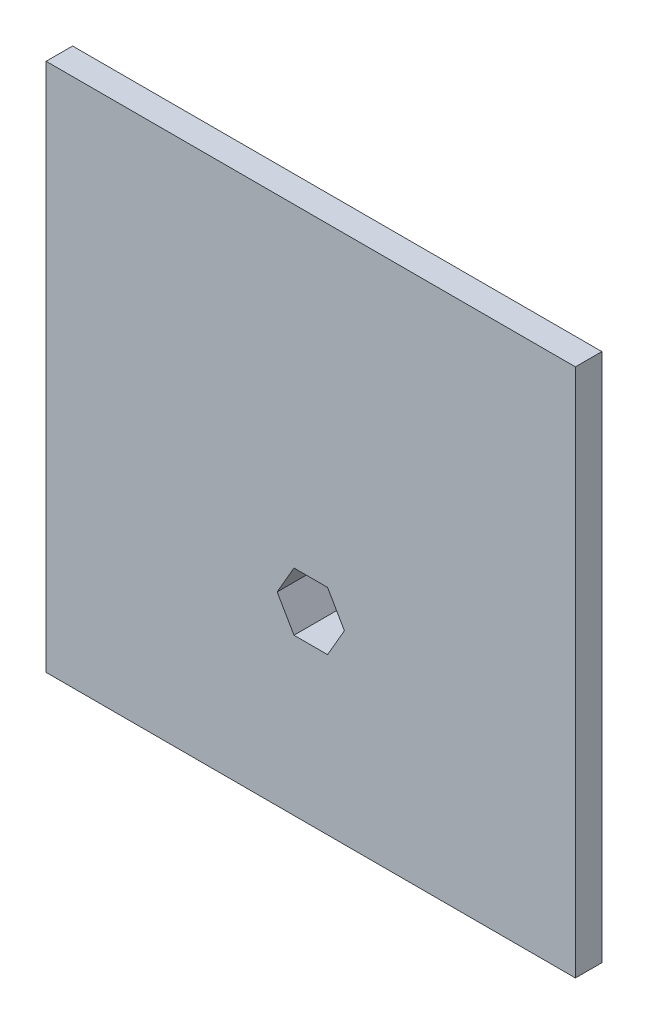
ISO-10303-21;
HEADER;
FILE_DESCRIPTION(('STEP AP214'),'2;1');
FILE_NAME('part.step','',(''),(''),'','','');
FILE_SCHEMA(('AUTOMOTIVE_DESIGN { 1 0 10303 214 1 1 1 1 }'));
ENDSEC;
DATA;
#1=APPLICATION_CONTEXT('core data for automotive mechanical design processes');
#2=APPLICATION_PROTOCOL_DEFINITION('international standard','automotive_design',2000,#1);
#3=PRODUCT_CONTEXT('',#1,'mechanical');
#4=PRODUCT('Part','Part','',(#3));
#5=PRODUCT_RELATED_PRODUCT_CATEGORY('part','',(#4));
#6=PRODUCT_DEFINITION_FORMATION('','',#4);
#7=PRODUCT_DEFINITION_CONTEXT('part definition',#1,'design');
#8=PRODUCT_DEFINITION('design','',#6,#7);
#9=PRODUCT_DEFINITION_SHAPE('','',#8);
#10=(LENGTH_UNIT() NAMED_UNIT(*) SI_UNIT(.MILLI.,.METRE.));
#11=(NAMED_UNIT(*) PLANE_ANGLE_UNIT() SI_UNIT($,.RADIAN.));
#12=(NAMED_UNIT(*) SI_UNIT($,.STERADIAN.) SOLID_ANGLE_UNIT());
#13=UNCERTAINTY_MEASURE_WITH_UNIT(LENGTH_MEASURE(1.E-05),#10,'distance_accuracy_value','');
#14=(GEOMETRIC_REPRESENTATION_CONTEXT(3) GLOBAL_UNCERTAINTY_ASSIGNED_CONTEXT((#13)) GLOBAL_UNIT_ASSIGNED_CONTEXT((#10,
#11,#12)) REPRESENTATION_CONTEXT('',''));
#15=CARTESIAN_POINT('',(0.,0.,0.));
#16=DIRECTION('',(0.,0.,1.));
#17=DIRECTION('',(1.,0.,0.));
#18=AXIS2_PLACEMENT_3D('',#15,#16,#17);
#19=CARTESIAN_POINT('',(-3.17542648054,-5.5,5.));
#20=DIRECTION('',(0.,1.,0.));
#21=DIRECTION('',(1.,0.,0.));
#22=AXIS2_PLACEMENT_3D('',#19,#20,#21);
#23=PLANE('',#22);
#24=DIRECTION('',(0.,0.,-1.));
#25=VECTOR('',#24,1.);
#26=CARTESIAN_POINT('',(-3.17542648054,-5.5,-3.75));
#27=LINE('',#26,#25);
#28=CARTESIAN_POINT('',(-3.17542648054,-5.5,5.));
#29=VERTEX_POINT('',#28);
#30=CARTESIAN_POINT('',(-3.17542648054,-5.5,-12.5));
#31=VERTEX_POINT('',#30);
#32=EDGE_CURVE('E11',#29,#31,#27,.T.);
#33=ORIENTED_EDGE('',*,*,#32,.F.);
#34=DIRECTION('',(1.,0.,0.));
#35=VECTOR('',#34,1.);
#36=CARTESIAN_POINT('',(0.,-5.5,5.));
#37=LINE('',#36,#35);
#38=CARTESIAN_POINT('',(3.17542648054,-5.5,5.));
#39=VERTEX_POINT('',#38);
#40=EDGE_CURVE('E284',#29,#39,#37,.T.);
#41=ORIENTED_EDGE('',*,*,#40,.T.);
#42=DIRECTION('',(0.,0.,-1.));
#43=VECTOR('',#42,1.);
#44=CARTESIAN_POINT('',(3.17542648054,-5.5,-3.75));
#45=LINE('',#44,#43);
#46=CARTESIAN_POINT('',(3.17542648054,-5.5,-12.5));
#47=VERTEX_POINT('',#46);
#48=EDGE_CURVE('E28',#39,#47,#45,.T.);
#49=ORIENTED_EDGE('',*,*,#48,.T.);
#50=DIRECTION('',(1.,0.,0.));
#51=VECTOR('',#50,1.);
#52=CARTESIAN_POINT('',(0.,-5.5,-12.5));
#53=LINE('',#52,#51);
#54=EDGE_CURVE('E174',#31,#47,#53,.T.);
#55=ORIENTED_EDGE('',*,*,#54,.F.);
#56=EDGE_LOOP('',(#33,#41,#49,#55));
#57=FACE_BOUND('',#56,.T.);
#58=ADVANCED_FACE('F17',(#57),#23,.T.);
#59=CARTESIAN_POINT('',(-6.35085296109,0.,5.));
#60=DIRECTION('',(0.866025403784329,0.50000000000019,0.));
#61=DIRECTION('',(0.,0.,-1.));
#62=AXIS2_PLACEMENT_3D('',#59,#60,#61);
#63=PLANE('',#62);
#64=DIRECTION('',(0.,0.,-1.));
#65=VECTOR('',#64,1.);
#66=CARTESIAN_POINT('',(-6.35085296109,0.,-3.75));
#67=LINE('',#66,#65);
#68=CARTESIAN_POINT('',(-6.35085296109,0.,5.));
#69=VERTEX_POINT('',#68);
#70=CARTESIAN_POINT('',(-6.35085296109,0.,-12.5));
#71=VERTEX_POINT('',#70);
#72=EDGE_CURVE('E187',#69,#71,#67,.T.);
#73=ORIENTED_EDGE('',*,*,#72,.F.);
#74=DIRECTION('',(0.50000000000019,-0.866025403784329,0.));
#75=VECTOR('',#74,1.);
#76=CARTESIAN_POINT('',(-4.76313972081,-2.75,5.));
#77=LINE('',#76,#75);
#78=EDGE_CURVE('E217',#69,#29,#77,.T.);
#79=ORIENTED_EDGE('',*,*,#78,.T.);
#80=ORIENTED_EDGE('',*,*,#32,.T.);
#81=DIRECTION('',(0.50000000000019,-0.866025403784329,0.));
#82=VECTOR('',#81,1.);
#83=CARTESIAN_POINT('',(-4.76313972081,-2.75,-12.5));
#84=LINE('',#83,#82);
#85=EDGE_CURVE('E243',#71,#31,#84,.T.);
#86=ORIENTED_EDGE('',*,*,#85,.F.);
#87=EDGE_LOOP('',(#73,#79,#80,#86));
#88=FACE_BOUND('',#87,.T.);
#89=ADVANCED_FACE('F526',(#88),#63,.T.);
#90=CARTESIAN_POINT('',(3.17542648054,-5.5,5.));
#91=DIRECTION('',(-0.866025403784329,0.50000000000019,0.));
#92=DIRECTION('',(0.,0.,1.));
#93=AXIS2_PLACEMENT_3D('',#90,#91,#92);
#94=PLANE('',#93);
#95=ORIENTED_EDGE('',*,*,#48,.F.);
#96=DIRECTION('',(0.50000000000019,0.866025403784329,0.));
#97=VECTOR('',#96,1.);
#98=CARTESIAN_POINT('',(4.76313972081,-2.75,5.));
#99=LINE('',#98,#97);
#100=CARTESIAN_POINT('',(6.35085296109,0.,5.));
#101=VERTEX_POINT('',#100);
#102=EDGE_CURVE('E192',#39,#101,#99,.T.);
#103=ORIENTED_EDGE('',*,*,#102,.T.);
#104=DIRECTION('',(0.,0.,-1.));
#105=VECTOR('',#104,1.);
#106=CARTESIAN_POINT('',(6.35085296109,0.,-3.75));
#107=LINE('',#106,#105);
#108=CARTESIAN_POINT('',(6.35085296109,0.,-12.5));
#109=VERTEX_POINT('',#108);
#110=EDGE_CURVE('E183',#101,#109,#107,.T.);
#111=ORIENTED_EDGE('',*,*,#110,.T.);
#112=DIRECTION('',(0.50000000000019,0.866025403784329,0.));
#113=VECTOR('',#112,1.);
#114=CARTESIAN_POINT('',(4.76313972081,-2.75,-12.5));
#115=LINE('',#114,#113);
#116=EDGE_CURVE('E167',#47,#109,#115,.T.);
#117=ORIENTED_EDGE('',*,*,#116,.F.);
#118=EDGE_LOOP('',(#95,#103,#111,#117));
#119=FACE_BOUND('',#118,.T.);
#120=ADVANCED_FACE('F190',(#119),#94,.T.);
#121=CARTESIAN_POINT('',(0.,0.,-12.5));
#122=DIRECTION('',(0.,0.,1.));
#123=DIRECTION('',(1.,0.,0.));
#124=AXIS2_PLACEMENT_3D('',#121,#122,#123);
#125=PLANE('',#124);
#126=CARTESIAN_POINT('',(0.,0.,-12.5));
#127=DIRECTION('',(0.,0.,1.));
#128=DIRECTION('',(1.,0.,0.));
#129=AXIS2_PLACEMENT_3D('',#126,#127,#128);
#130=CIRCLE('',#129,3.25);
#131=CARTESIAN_POINT('',(3.25,0.,-12.5));
#132=VERTEX_POINT('',#131);
#133=CARTESIAN_POINT('',(-3.25,0.,-12.5));
#134=VERTEX_POINT('',#133);
#135=EDGE_CURVE('E265',#132,#134,#130,.T.);
#136=ORIENTED_EDGE('',*,*,#135,.F.);
#137=CARTESIAN_POINT('',(0.,0.,-12.5));
#138=DIRECTION('',(0.,0.,1.));
#139=DIRECTION('',(1.,0.,0.));
#140=AXIS2_PLACEMENT_3D('',#137,#138,#139);
#141=CIRCLE('',#140,3.25);
#142=EDGE_CURVE('E304',#134,#132,#141,.T.);
#143=ORIENTED_EDGE('',*,*,#142,.F.);
#144=EDGE_LOOP('',(#136,#143));
#145=FACE_BOUND('',#144,.T.);
#146=DIRECTION('',(-1.,0.,0.));
#147=VECTOR('',#146,1.);
#148=CARTESIAN_POINT('',(0.,5.5,-12.5));
#149=LINE('',#148,#147);
#150=CARTESIAN_POINT('',(3.17542648054,5.5,-12.5));
#151=VERTEX_POINT('',#150);
#152=CARTESIAN_POINT('',(-3.17542648054,5.5,-12.5));
#153=VERTEX_POINT('',#152);
#154=EDGE_CURVE('E194',#151,#153,#149,.T.);
#155=ORIENTED_EDGE('',*,*,#154,.T.);
#156=DIRECTION('',(-0.50000000000019,-0.866025403784329,0.));
#157=VECTOR('',#156,1.);
#158=CARTESIAN_POINT('',(-4.76313972081,2.75,-12.5));
#159=LINE('',#158,#157);
#160=EDGE_CURVE('E246',#153,#71,#159,.T.);
#161=ORIENTED_EDGE('',*,*,#160,.T.);
#162=ORIENTED_EDGE('',*,*,#85,.T.);
#163=ORIENTED_EDGE('',*,*,#54,.T.);
#164=ORIENTED_EDGE('',*,*,#116,.T.);
#165=DIRECTION('',(-0.50000000000019,0.866025403784329,0.));
#166=VECTOR('',#165,1.);
#167=CARTESIAN_POINT('',(4.76313972081,2.75,-12.5));
#168=LINE('',#167,#166);
#169=EDGE_CURVE('E171',#109,#151,#168,.T.);
#170=ORIENTED_EDGE('',*,*,#169,.T.);
#171=EDGE_LOOP('',(#155,#161,#162,#163,#164,#170));
#172=FACE_BOUND('',#171,.T.);
#173=ADVANCED_FACE('F170',(#145,#172),#125,.T.);
#174=CARTESIAN_POINT('',(-3.17542648054,5.5,5.));
#175=DIRECTION('',(0.866025403784329,-0.50000000000019,0.));
#176=DIRECTION('',(0.,0.,-1.));
#177=AXIS2_PLACEMENT_3D('',#174,#175,#176);
#178=PLANE('',#177);
#179=DIRECTION('',(0.,0.,-1.));
#180=VECTOR('',#179,1.);
#181=CARTESIAN_POINT('',(-3.17542648054,5.5,-3.75));
#182=LINE('',#181,#180);
#183=CARTESIAN_POINT('',(-3.17542648054,5.5,5.));
#184=VERTEX_POINT('',#183);
#185=EDGE_CURVE('E200',#184,#153,#182,.T.);
#186=ORIENTED_EDGE('',*,*,#185,.F.);
#187=DIRECTION('',(-0.50000000000019,-0.866025403784329,0.));
#188=VECTOR('',#187,1.);
#189=CARTESIAN_POINT('',(-4.76313972081,2.75,5.));
#190=LINE('',#189,#188);
#191=EDGE_CURVE('E212',#184,#69,#190,.T.);
#192=ORIENTED_EDGE('',*,*,#191,.T.);
#193=ORIENTED_EDGE('',*,*,#72,.T.);
#194=ORIENTED_EDGE('',*,*,#160,.F.);
#195=EDGE_LOOP('',(#186,#192,#193,#194));
#196=FACE_BOUND('',#195,.T.);
#197=ADVANCED_FACE('F448',(#196),#178,.T.);
#198=CARTESIAN_POINT('',(6.35085296109,0.,5.));
#199=DIRECTION('',(-0.866025403784329,-0.50000000000019,0.));
#200=DIRECTION('',(-0.50000000000019,0.866025403784329,0.));
#201=AXIS2_PLACEMENT_3D('',#198,#199,#200);
#202=PLANE('',#201);
#203=ORIENTED_EDGE('',*,*,#110,.F.);
#204=DIRECTION('',(-0.50000000000019,0.866025403784329,0.));
#205=VECTOR('',#204,1.);
#206=CARTESIAN_POINT('',(4.76313972081,2.75,5.));
#207=LINE('',#206,#205);
#208=CARTESIAN_POINT('',(3.17542648054,5.5,5.));
#209=VERTEX_POINT('',#208);
#210=EDGE_CURVE('E218',#101,#209,#207,.T.);
#211=ORIENTED_EDGE('',*,*,#210,.T.);
#212=DIRECTION('',(0.,0.,-1.));
#213=VECTOR('',#212,1.);
#214=CARTESIAN_POINT('',(3.17542648054,5.5,-3.75));
#215=LINE('',#214,#213);
#216=EDGE_CURVE('E185',#209,#151,#215,.T.);
#217=ORIENTED_EDGE('',*,*,#216,.T.);
#218=ORIENTED_EDGE('',*,*,#169,.F.);
#219=EDGE_LOOP('',(#203,#211,#217,#218));
#220=FACE_BOUND('',#219,.T.);
#221=ADVANCED_FACE('F181',(#220),#202,.T.);
#222=CARTESIAN_POINT('',(3.17542648054,5.5,5.));
#223=DIRECTION('',(0.,-1.,0.));
#224=DIRECTION('',(0.,0.,-1.));
#225=AXIS2_PLACEMENT_3D('',#222,#223,#224);
#226=PLANE('',#225);
#227=ORIENTED_EDGE('',*,*,#216,.F.);
#228=DIRECTION('',(-1.,0.,0.));
#229=VECTOR('',#228,1.);
#230=CARTESIAN_POINT('',(0.,5.5,5.));
#231=LINE('',#230,#229);
#232=EDGE_CURVE('E216',#209,#184,#231,.T.);
#233=ORIENTED_EDGE('',*,*,#232,.T.);
#234=ORIENTED_EDGE('',*,*,#185,.T.);
#235=ORIENTED_EDGE('',*,*,#154,.F.);
#236=EDGE_LOOP('',(#227,#233,#234,#235));
#237=FACE_BOUND('',#236,.T.);
#238=ADVANCED_FACE('F439',(#237),#226,.T.);
#239=CARTESIAN_POINT('',(0.,0.,5.));
#240=DIRECTION('',(0.,0.,1.));
#241=DIRECTION('',(1.,0.,0.));
#242=AXIS2_PLACEMENT_3D('',#239,#240,#241);
#243=PLANE('',#242);
#244=ORIENTED_EDGE('',*,*,#102,.F.);
#245=ORIENTED_EDGE('',*,*,#40,.F.);
#246=ORIENTED_EDGE('',*,*,#78,.F.);
#247=ORIENTED_EDGE('',*,*,#191,.F.);
#248=ORIENTED_EDGE('',*,*,#232,.F.);
#249=ORIENTED_EDGE('',*,*,#210,.F.);
#250=EDGE_LOOP('',(#244,#245,#246,#247,#248,#249));
#251=FACE_BOUND('',#250,.T.);
#252=DIRECTION('',(0.,-1.,0.));
#253=VECTOR('',#252,1.);
#254=CARTESIAN_POINT('',(-50.,15.,5.));
#255=LINE('',#254,#253);
#256=CARTESIAN_POINT('',(-50.,65.,5.));
#257=VERTEX_POINT('',#256);
#258=CARTESIAN_POINT('',(-50.,-35.,5.));
#259=VERTEX_POINT('',#258);
#260=EDGE_CURVE('E256',#257,#259,#255,.T.);
#261=ORIENTED_EDGE('',*,*,#260,.T.);
#262=DIRECTION('',(1.,0.,0.));
#263=VECTOR('',#262,1.);
#264=CARTESIAN_POINT('',(0.,-35.,5.));
#265=LINE('',#264,#263);
#266=CARTESIAN_POINT('',(50.,-35.,5.));
#267=VERTEX_POINT('',#266);
#268=EDGE_CURVE('E321',#259,#267,#265,.T.);
#269=ORIENTED_EDGE('',*,*,#268,.T.);
#270=DIRECTION('',(0.,1.,0.));
#271=VECTOR('',#270,1.);
#272=CARTESIAN_POINT('',(50.,15.,5.));
#273=LINE('',#272,#271);
#274=CARTESIAN_POINT('',(50.,65.,5.));
#275=VERTEX_POINT('',#274);
#276=EDGE_CURVE('E269',#267,#275,#273,.T.);
#277=ORIENTED_EDGE('',*,*,#276,.T.);
#278=DIRECTION('',(-1.,0.,0.));
#279=VECTOR('',#278,1.);
#280=CARTESIAN_POINT('',(0.,65.,5.));
#281=LINE('',#280,#279);
#282=EDGE_CURVE('E226',#275,#257,#281,.T.);
#283=ORIENTED_EDGE('',*,*,#282,.T.);
#284=EDGE_LOOP('',(#261,#269,#277,#283));
#285=FACE_BOUND('',#284,.T.);
#286=ADVANCED_FACE('F433',(#251,#285),#243,.T.);
#287=CARTESIAN_POINT('',(0.,0.,-15.));
#288=DIRECTION('',(0.,0.,-1.));
#289=DIRECTION('',(1.,0.,0.));
#290=AXIS2_PLACEMENT_3D('',#287,#288,#289);
#291=CYLINDRICAL_SURFACE('',#290,3.25);
#292=ORIENTED_EDGE('',*,*,#135,.T.);
#293=DIRECTION('',(0.,0.,1.));
#294=VECTOR('',#293,1.);
#295=CARTESIAN_POINT('',(-3.25,0.,-15.));
#296=LINE('',#295,#294);
#297=CARTESIAN_POINT('',(-3.25,0.,-29.));
#298=VERTEX_POINT('',#297);
#299=EDGE_CURVE('E268',#298,#134,#296,.T.);
#300=ORIENTED_EDGE('',*,*,#299,.F.);
#301=CARTESIAN_POINT('',(0.,0.,-29.));
#302=DIRECTION('',(0.,0.,-1.));
#303=DIRECTION('',(1.,0.,0.));
#304=AXIS2_PLACEMENT_3D('',#301,#302,#303);
#305=CIRCLE('',#304,3.25);
#306=CARTESIAN_POINT('',(3.25,0.,-29.));
#307=VERTEX_POINT('',#306);
#308=EDGE_CURVE('E242',#298,#307,#305,.T.);
#309=ORIENTED_EDGE('',*,*,#308,.T.);
#310=DIRECTION('',(0.,0.,1.));
#311=VECTOR('',#310,1.);
#312=CARTESIAN_POINT('',(3.25,0.,-15.));
#313=LINE('',#312,#311);
#314=EDGE_CURVE('E305',#307,#132,#313,.T.);
#315=ORIENTED_EDGE('',*,*,#314,.T.);
#316=EDGE_LOOP('',(#292,#300,#309,#315));
#317=FACE_BOUND('',#316,.T.);
#318=ADVANCED_FACE('F438',(#317),#291,.F.);
#319=CARTESIAN_POINT('',(0.,0.,-15.));
#320=DIRECTION('',(0.,0.,-1.));
#321=DIRECTION('',(1.,0.,0.));
#322=AXIS2_PLACEMENT_3D('',#319,#320,#321);
#323=CYLINDRICAL_SURFACE('',#322,3.25);
#324=ORIENTED_EDGE('',*,*,#142,.T.);
#325=ORIENTED_EDGE('',*,*,#314,.F.);
#326=CARTESIAN_POINT('',(0.,0.,-29.));
#327=DIRECTION('',(0.,0.,-1.));
#328=DIRECTION('',(1.,0.,0.));
#329=AXIS2_PLACEMENT_3D('',#326,#327,#328);
#330=CIRCLE('',#329,3.25);
#331=EDGE_CURVE('E250',#307,#298,#330,.T.);
#332=ORIENTED_EDGE('',*,*,#331,.T.);
#333=ORIENTED_EDGE('',*,*,#299,.T.);
#334=EDGE_LOOP('',(#324,#325,#332,#333));
#335=FACE_BOUND('',#334,.T.);
#336=ADVANCED_FACE('F518',(#335),#323,.F.);
#337=CARTESIAN_POINT('',(0.,0.,0.));
#338=DIRECTION('',(0.,0.,1.));
#339=DIRECTION('',(1.,0.,0.));
#340=AXIS2_PLACEMENT_3D('',#337,#338,#339);
#341=PLANE('',#340);
#342=CARTESIAN_POINT('',(0.,0.,0.));
#343=DIRECTION('',(0.,0.,-1.));
#344=DIRECTION('',(1.,0.,0.));
#345=AXIS2_PLACEMENT_3D('',#342,#343,#344);
#346=CIRCLE('',#345,15.);
#347=CARTESIAN_POINT('',(-1.01989136537E-13,-15.,0.));
#348=VERTEX_POINT('',#347);
#349=CARTESIAN_POINT('',(-15.,0.,0.));
#350=VERTEX_POINT('',#349);
#351=EDGE_CURVE('E239',#348,#350,#346,.T.);
#352=ORIENTED_EDGE('',*,*,#351,.F.);
#353=CARTESIAN_POINT('',(0.,0.,0.));
#354=DIRECTION('',(0.,0.,-1.));
#355=DIRECTION('',(1.,0.,0.));
#356=AXIS2_PLACEMENT_3D('',#353,#354,#355);
#357=CIRCLE('',#356,15.);
#358=CARTESIAN_POINT('',(15.,0.,0.));
#359=VERTEX_POINT('',#358);
#360=EDGE_CURVE('E264',#359,#348,#357,.T.);
#361=ORIENTED_EDGE('',*,*,#360,.F.);
#362=DIRECTION('',(0.,-1.,0.));
#363=VECTOR('',#362,1.);
#364=CARTESIAN_POINT('',(15.,30.,0.));
#365=LINE('',#364,#363);
#366=CARTESIAN_POINT('',(15.,60.,0.));
#367=VERTEX_POINT('',#366);
#368=EDGE_CURVE('E230',#367,#359,#365,.T.);
#369=ORIENTED_EDGE('',*,*,#368,.F.);
#370=DIRECTION('',(-1.,0.,0.));
#371=VECTOR('',#370,1.);
#372=CARTESIAN_POINT('',(0.,60.,0.));
#373=LINE('',#372,#371);
#374=CARTESIAN_POINT('',(-15.,60.,0.));
#375=VERTEX_POINT('',#374);
#376=EDGE_CURVE('E301',#367,#375,#373,.T.);
#377=ORIENTED_EDGE('',*,*,#376,.T.);
#378=DIRECTION('',(0.,1.,0.));
#379=VECTOR('',#378,1.);
#380=CARTESIAN_POINT('',(-15.,30.,0.));
#381=LINE('',#380,#379);
#382=EDGE_CURVE('E259',#350,#375,#381,.T.);
#383=ORIENTED_EDGE('',*,*,#382,.F.);
#384=EDGE_LOOP('',(#352,#361,#369,#377,#383));
#385=FACE_BOUND('',#384,.T.);
#386=DIRECTION('',(-1.,0.,0.));
#387=VECTOR('',#386,1.);
#388=CARTESIAN_POINT('',(0.,65.,0.));
#389=LINE('',#388,#387);
#390=CARTESIAN_POINT('',(50.,65.,0.));
#391=VERTEX_POINT('',#390);
#392=CARTESIAN_POINT('',(-50.,65.,0.));
#393=VERTEX_POINT('',#392);
#394=EDGE_CURVE('E334',#391,#393,#389,.T.);
#395=ORIENTED_EDGE('',*,*,#394,.F.);
#396=DIRECTION('',(0.,1.,0.));
#397=VECTOR('',#396,1.);
#398=CARTESIAN_POINT('',(50.,15.,0.));
#399=LINE('',#398,#397);
#400=CARTESIAN_POINT('',(50.,-35.,0.));
#401=VERTEX_POINT('',#400);
#402=EDGE_CURVE('E225',#401,#391,#399,.T.);
#403=ORIENTED_EDGE('',*,*,#402,.F.);
#404=DIRECTION('',(1.,0.,0.));
#405=VECTOR('',#404,1.);
#406=CARTESIAN_POINT('',(0.,-35.,0.));
#407=LINE('',#406,#405);
#408=CARTESIAN_POINT('',(-50.,-35.,0.));
#409=VERTEX_POINT('',#408);
#410=EDGE_CURVE('E297',#409,#401,#407,.T.);
#411=ORIENTED_EDGE('',*,*,#410,.F.);
#412=DIRECTION('',(0.,-1.,0.));
#413=VECTOR('',#412,1.);
#414=CARTESIAN_POINT('',(-50.,15.,0.));
#415=LINE('',#414,#413);
#416=EDGE_CURVE('E260',#393,#409,#415,.T.);
#417=ORIENTED_EDGE('',*,*,#416,.F.);
#418=EDGE_LOOP('',(#395,#403,#411,#417));
#419=FACE_BOUND('',#418,.T.);
#420=ADVANCED_FACE('F472',(#385,#419),#341,.F.);
#421=CARTESIAN_POINT('',(15.,60.,0.));
#422=DIRECTION('',(0.,0.554700196224998,-0.832050294337998));
#423=DIRECTION('',(-1.,0.,0.));
#424=AXIS2_PLACEMENT_3D('',#421,#422,#423);
#425=PLANE('',#424);
#426=ORIENTED_EDGE('',*,*,#376,.F.);
#427=DIRECTION('',(0.,-0.832050294337998,-0.554700196224998));
#428=VECTOR('',#427,1.);
#429=CARTESIAN_POINT('',(15.,38.25,-14.5));
#430=LINE('',#429,#428);
#431=CARTESIAN_POINT('',(15.,16.5,-29.));
#432=VERTEX_POINT('',#431);
#433=EDGE_CURVE('E235',#367,#432,#430,.T.);
#434=ORIENTED_EDGE('',*,*,#433,.T.);
#435=DIRECTION('',(-1.,0.,0.));
#436=VECTOR('',#435,1.);
#437=CARTESIAN_POINT('',(0.,16.5,-29.));
#438=LINE('',#437,#436);
#439=CARTESIAN_POINT('',(-15.,16.5,-29.));
#440=VERTEX_POINT('',#439);
#441=EDGE_CURVE('E255',#432,#440,#438,.T.);
#442=ORIENTED_EDGE('',*,*,#441,.T.);
#443=DIRECTION('',(0.,-0.832050294337998,-0.554700196224998));
#444=VECTOR('',#443,1.);
#445=CARTESIAN_POINT('',(-15.,38.25,-14.5));
#446=LINE('',#445,#444);
#447=EDGE_CURVE('E204',#375,#440,#446,.T.);
#448=ORIENTED_EDGE('',*,*,#447,.F.);
#449=EDGE_LOOP('',(#426,#434,#442,#448));
#450=FACE_BOUND('',#449,.T.);
#451=ADVANCED_FACE('F424',(#450),#425,.T.);
#452=CARTESIAN_POINT('',(-15.,0.,0.));
#453=DIRECTION('',(-1.,0.,0.));
#454=DIRECTION('',(0.,0.,1.));
#455=AXIS2_PLACEMENT_3D('',#452,#453,#454);
#456=PLANE('',#455);
#457=DIRECTION('',(0.,0.,-1.));
#458=VECTOR('',#457,1.);
#459=CARTESIAN_POINT('',(-15.,0.,-15.));
#460=LINE('',#459,#458);
#461=CARTESIAN_POINT('',(-15.,0.,-29.));
#462=VERTEX_POINT('',#461);
#463=EDGE_CURVE('E236',#350,#462,#460,.T.);
#464=ORIENTED_EDGE('',*,*,#463,.F.);
#465=ORIENTED_EDGE('',*,*,#382,.T.);
#466=ORIENTED_EDGE('',*,*,#447,.T.);
#467=DIRECTION('',(0.,-1.,0.));
#468=VECTOR('',#467,1.);
#469=CARTESIAN_POINT('',(-15.,8.25,-29.));
#470=LINE('',#469,#468);
#471=EDGE_CURVE('E210',#440,#462,#470,.T.);
#472=ORIENTED_EDGE('',*,*,#471,.T.);
#473=EDGE_LOOP('',(#464,#465,#466,#472));
#474=FACE_BOUND('',#473,.T.);
#475=ADVANCED_FACE('F419',(#474),#456,.T.);
#476=CARTESIAN_POINT('',(-50.,65.,0.));
#477=DIRECTION('',(-1.,0.,0.));
#478=DIRECTION('',(0.,0.,1.));
#479=AXIS2_PLACEMENT_3D('',#476,#477,#478);
#480=PLANE('',#479);
#481=DIRECTION('',(0.,0.,1.));
#482=VECTOR('',#481,1.);
#483=CARTESIAN_POINT('',(-50.,65.,2.5));
#484=LINE('',#483,#482);
#485=EDGE_CURVE('E281',#393,#257,#484,.T.);
#486=ORIENTED_EDGE('',*,*,#485,.F.);
#487=ORIENTED_EDGE('',*,*,#416,.T.);
#488=DIRECTION('',(0.,0.,1.));
#489=VECTOR('',#488,1.);
#490=CARTESIAN_POINT('',(-50.,-35.,2.5));
#491=LINE('',#490,#489);
#492=EDGE_CURVE('E272',#409,#259,#491,.T.);
#493=ORIENTED_EDGE('',*,*,#492,.T.);
#494=ORIENTED_EDGE('',*,*,#260,.F.);
#495=EDGE_LOOP('',(#486,#487,#493,#494));
#496=FACE_BOUND('',#495,.T.);
#497=ADVANCED_FACE('F19',(#496),#480,.T.);
#498=CARTESIAN_POINT('',(50.,-35.,0.));
#499=DIRECTION('',(0.,1.,0.));
#500=DIRECTION('',(1.,0.,0.));
#501=AXIS2_PLACEMENT_3D('',#498,#499,#500);
#502=PLANE('',#501);
#503=ORIENTED_EDGE('',*,*,#492,.F.);
#504=ORIENTED_EDGE('',*,*,#410,.T.);
#505=DIRECTION('',(0.,0.,1.));
#506=VECTOR('',#505,1.);
#507=CARTESIAN_POINT('',(50.,-35.,2.5));
#508=LINE('',#507,#506);
#509=EDGE_CURVE('E221',#401,#267,#508,.T.);
#510=ORIENTED_EDGE('',*,*,#509,.T.);
#511=ORIENTED_EDGE('',*,*,#268,.F.);
#512=EDGE_LOOP('',(#503,#504,#510,#511));
#513=FACE_BOUND('',#512,.T.);
#514=ADVANCED_FACE('F486',(#513),#502,.F.);
#515=CARTESIAN_POINT('',(50.,-35.,0.));
#516=DIRECTION('',(1.,0.,0.));
#517=DIRECTION('',(0.,1.,0.));
#518=AXIS2_PLACEMENT_3D('',#515,#516,#517);
#519=PLANE('',#518);
#520=ORIENTED_EDGE('',*,*,#509,.F.);
#521=ORIENTED_EDGE('',*,*,#402,.T.);
#522=DIRECTION('',(0.,0.,1.));
#523=VECTOR('',#522,1.);
#524=CARTESIAN_POINT('',(50.,65.,2.5));
#525=LINE('',#524,#523);
#526=EDGE_CURVE('E21',#391,#275,#525,.T.);
#527=ORIENTED_EDGE('',*,*,#526,.T.);
#528=ORIENTED_EDGE('',*,*,#276,.F.);
#529=EDGE_LOOP('',(#520,#521,#527,#528));
#530=FACE_BOUND('',#529,.T.);
#531=ADVANCED_FACE('F480',(#530),#519,.T.);
#532=CARTESIAN_POINT('',(-50.,65.,0.));
#533=DIRECTION('',(0.,-1.,0.));
#534=DIRECTION('',(0.,0.,-1.));
#535=AXIS2_PLACEMENT_3D('',#532,#533,#534);
#536=PLANE('',#535);
#537=ORIENTED_EDGE('',*,*,#526,.F.);
#538=ORIENTED_EDGE('',*,*,#394,.T.);
#539=ORIENTED_EDGE('',*,*,#485,.T.);
#540=ORIENTED_EDGE('',*,*,#282,.F.);
#541=EDGE_LOOP('',(#537,#538,#539,#540));
#542=FACE_BOUND('',#541,.T.);
#543=ADVANCED_FACE('F485',(#542),#536,.F.);
#544=CARTESIAN_POINT('',(0.,0.,-15.));
#545=DIRECTION('',(0.,0.,-1.));
#546=DIRECTION('',(0.,-1.,0.));
#547=AXIS2_PLACEMENT_3D('',#544,#545,#546);
#548=CYLINDRICAL_SURFACE('',#547,15.);
#549=DIRECTION('',(0.,0.,-1.));
#550=VECTOR('',#549,1.);
#551=CARTESIAN_POINT('',(0.,-15.,-15.));
#552=LINE('',#551,#550);
#553=CARTESIAN_POINT('',(0.,-15.,-29.));
#554=VERTEX_POINT('',#553);
#555=EDGE_CURVE('E261',#348,#554,#552,.T.);
#556=ORIENTED_EDGE('',*,*,#555,.F.);
#557=ORIENTED_EDGE('',*,*,#351,.T.);
#558=ORIENTED_EDGE('',*,*,#463,.T.);
#559=CARTESIAN_POINT('',(0.,0.,-29.));
#560=DIRECTION('',(0.,0.,-1.));
#561=DIRECTION('',(1.,0.,0.));
#562=AXIS2_PLACEMENT_3D('',#559,#560,#561);
#563=CIRCLE('',#562,15.);
#564=EDGE_CURVE('E206',#554,#462,#563,.T.);
#565=ORIENTED_EDGE('',*,*,#564,.F.);
#566=EDGE_LOOP('',(#556,#557,#558,#565));
#567=FACE_BOUND('',#566,.T.);
#568=ADVANCED_FACE('F409',(#567),#548,.T.);
#569=CARTESIAN_POINT('',(0.,0.,-15.));
#570=DIRECTION('',(0.,0.,-1.));
#571=DIRECTION('',(1.,0.,0.));
#572=AXIS2_PLACEMENT_3D('',#569,#570,#571);
#573=CYLINDRICAL_SURFACE('',#572,15.);
#574=DIRECTION('',(0.,0.,-1.));
#575=VECTOR('',#574,1.);
#576=CARTESIAN_POINT('',(15.,0.,-14.5));
#577=LINE('',#576,#575);
#578=CARTESIAN_POINT('',(15.,0.,-29.));
#579=VERTEX_POINT('',#578);
#580=EDGE_CURVE('E234',#359,#579,#577,.T.);
#581=ORIENTED_EDGE('',*,*,#580,.F.);
#582=ORIENTED_EDGE('',*,*,#360,.T.);
#583=ORIENTED_EDGE('',*,*,#555,.T.);
#584=CARTESIAN_POINT('',(0.,0.,-29.));
#585=DIRECTION('',(0.,0.,-1.));
#586=DIRECTION('',(1.,0.,0.));
#587=AXIS2_PLACEMENT_3D('',#584,#585,#586);
#588=CIRCLE('',#587,15.);
#589=EDGE_CURVE('E211',#579,#554,#588,.T.);
#590=ORIENTED_EDGE('',*,*,#589,.F.);
#591=EDGE_LOOP('',(#581,#582,#583,#590));
#592=FACE_BOUND('',#591,.T.);
#593=ADVANCED_FACE('F402',(#592),#573,.T.);
#594=CARTESIAN_POINT('',(15.,0.,0.));
#595=DIRECTION('',(-1.,0.,0.));
#596=DIRECTION('',(0.,0.,1.));
#597=AXIS2_PLACEMENT_3D('',#594,#595,#596);
#598=PLANE('',#597);
#599=DIRECTION('',(0.,-1.,0.));
#600=VECTOR('',#599,1.);
#601=CARTESIAN_POINT('',(15.,8.25,-29.));
#602=LINE('',#601,#600);
#603=EDGE_CURVE('E251',#432,#579,#602,.T.);
#604=ORIENTED_EDGE('',*,*,#603,.F.);
#605=ORIENTED_EDGE('',*,*,#433,.F.);
#606=ORIENTED_EDGE('',*,*,#368,.T.);
#607=ORIENTED_EDGE('',*,*,#580,.T.);
#608=EDGE_LOOP('',(#604,#605,#606,#607));
#609=FACE_BOUND('',#608,.T.);
#610=ADVANCED_FACE('F408',(#609),#598,.F.);
#611=CARTESIAN_POINT('',(15.,16.5,-29.));
#612=DIRECTION('',(0.,0.,-1.));
#613=DIRECTION('',(0.,-1.,0.));
#614=AXIS2_PLACEMENT_3D('',#611,#612,#613);
#615=PLANE('',#614);
#616=ORIENTED_EDGE('',*,*,#331,.F.);
#617=ORIENTED_EDGE('',*,*,#308,.F.);
#618=EDGE_LOOP('',(#616,#617));
#619=FACE_BOUND('',#618,.T.);
#620=ORIENTED_EDGE('',*,*,#441,.F.);
#621=ORIENTED_EDGE('',*,*,#603,.T.);
#622=ORIENTED_EDGE('',*,*,#589,.T.);
#623=ORIENTED_EDGE('',*,*,#564,.T.);
#624=ORIENTED_EDGE('',*,*,#471,.F.);
#625=EDGE_LOOP('',(#620,#621,#622,#623,#624));
#626=FACE_BOUND('',#625,.T.);
#627=ADVANCED_FACE('F504',(#619,#626),#615,.T.);
#628=CLOSED_SHELL('',(#58,#89,#120,#173,#197,#221,#238,#286,#318,#336,#420,#451,#475,#497,#514,
#531,#543,#568,#593,#610,#627));
#629=MANIFOLD_SOLID_BREP('B1',#628);
#630=ADVANCED_BREP_SHAPE_REPRESENTATION('',(#18,#629),#14);
#631=SHAPE_DEFINITION_REPRESENTATION(#9,#630);
ENDSEC;
END-ISO-10303-21;
